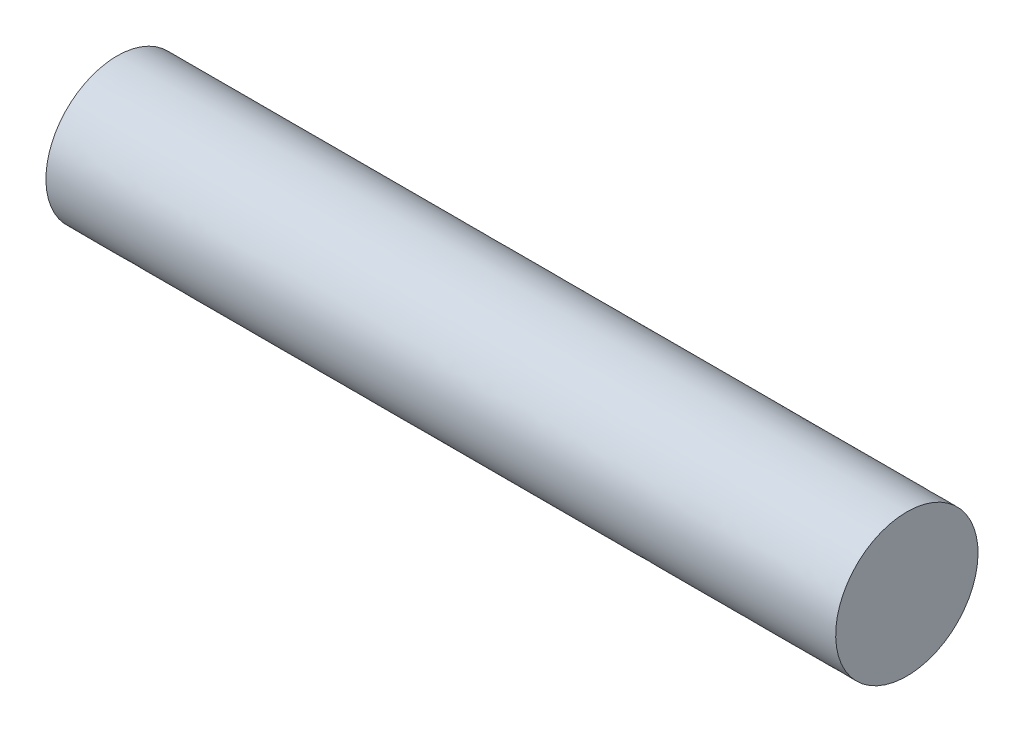
ISO-10303-21;
HEADER;
FILE_DESCRIPTION(('STEP AP214'),'2;1');
FILE_NAME('part.step','',(''),(''),'','','');
FILE_SCHEMA(('AUTOMOTIVE_DESIGN { 1 0 10303 214 1 1 1 1 }'));
ENDSEC;
DATA;
#1=APPLICATION_CONTEXT('core data for automotive mechanical design processes');
#2=APPLICATION_PROTOCOL_DEFINITION('international standard','automotive_design',2000,#1);
#3=PRODUCT_CONTEXT('',#1,'mechanical');
#4=PRODUCT('Part','Part','',(#3));
#5=PRODUCT_RELATED_PRODUCT_CATEGORY('part','',(#4));
#6=PRODUCT_DEFINITION_FORMATION('','',#4);
#7=PRODUCT_DEFINITION_CONTEXT('part definition',#1,'design');
#8=PRODUCT_DEFINITION('design','',#6,#7);
#9=PRODUCT_DEFINITION_SHAPE('','',#8);
#10=(LENGTH_UNIT() NAMED_UNIT(*) SI_UNIT(.MILLI.,.METRE.));
#11=(NAMED_UNIT(*) PLANE_ANGLE_UNIT() SI_UNIT($,.RADIAN.));
#12=(NAMED_UNIT(*) SI_UNIT($,.STERADIAN.) SOLID_ANGLE_UNIT());
#13=UNCERTAINTY_MEASURE_WITH_UNIT(LENGTH_MEASURE(1.E-05),#10,'distance_accuracy_value','');
#14=(GEOMETRIC_REPRESENTATION_CONTEXT(3) GLOBAL_UNCERTAINTY_ASSIGNED_CONTEXT((#13)) GLOBAL_UNIT_ASSIGNED_CONTEXT((#10,
#11,#12)) REPRESENTATION_CONTEXT('',''));
#15=CARTESIAN_POINT('',(0.,0.,0.));
#16=DIRECTION('',(0.,0.,1.));
#17=DIRECTION('',(1.,0.,0.));
#18=AXIS2_PLACEMENT_3D('',#15,#16,#17);
#19=CARTESIAN_POINT('',(1254.633,46.6198791903078,-2.17135769204912E-05));
#20=DIRECTION('',(1.,0.,0.));
#21=DIRECTION('',(0.,0.,-1.));
#22=AXIS2_PLACEMENT_3D('',#19,#20,#21);
#23=PLANE('',#22);
#24=CARTESIAN_POINT('',(1254.633,46.6198791903078,-2.17135769204912E-05));
#25=DIRECTION('',(1.,0.,0.));
#26=DIRECTION('',(0.,0.,-1.));
#27=AXIS2_PLACEMENT_3D('',#24,#25,#26);
#28=CIRCLE('',#27,80.23225);
#29=CARTESIAN_POINT('',(1254.633,126.852129190308,-2.17135769233751E-05));
#30=VERTEX_POINT('',#29);
#31=EDGE_CURVE('E12',#30,#30,#28,.T.);
#32=ORIENTED_EDGE('',*,*,#31,.T.);
#33=EDGE_LOOP('',(#32));
#34=FACE_BOUND('',#33,.T.);
#35=ADVANCED_FACE('F151',(#34),#23,.T.);
#36=CARTESIAN_POINT('',(284.607,126.852129190308,-2.17135769233751E-05));
#37=CARTESIAN_POINT('',(446.278,126.852129190308,-2.17135769233751E-05));
#38=CARTESIAN_POINT('',(769.62,126.852129190308,-2.17135769233751E-05));
#39=CARTESIAN_POINT('',(1092.962,126.852129190308,-2.17135769233751E-05));
#40=CARTESIAN_POINT('',(1254.633,126.852129190308,-2.17135769233751E-05));
#41=CARTESIAN_POINT('',(284.607,126.852129190308,7.2060606709319));
#42=CARTESIAN_POINT('',(446.278,126.852129190308,7.2060606709319));
#43=CARTESIAN_POINT('',(769.62,126.852129190308,7.2060606709319));
#44=CARTESIAN_POINT('',(1092.962,126.852129190308,7.2060606709319));
#45=CARTESIAN_POINT('',(1254.633,126.852129190308,7.2060606709319));
#46=CARTESIAN_POINT('',(284.607,124.899764770504,21.6176593161418));
#47=CARTESIAN_POINT('',(446.277999999999,124.899764770504,21.6176593161418));
#48=CARTESIAN_POINT('',(769.619999999999,124.899764770504,21.6176593161418));
#49=CARTESIAN_POINT('',(1092.962,124.899764770504,21.6176593161418));
#50=CARTESIAN_POINT('',(1254.633,124.899764770504,21.6176593161418));
#51=CARTESIAN_POINT('',(284.607,116.319986975036,41.675540282079));
#52=CARTESIAN_POINT('',(446.277999999999,116.319986975036,41.675540282079));
#53=CARTESIAN_POINT('',(769.619999999999,116.319986975036,41.675540282079));
#54=CARTESIAN_POINT('',(1092.962,116.319986975036,41.675540282079));
#55=CARTESIAN_POINT('',(1254.63299999999,116.319986975036,41.675540282079));
#56=CARTESIAN_POINT('',(284.607,102.711564342659,58.7258968160522));
#57=CARTESIAN_POINT('',(446.278,102.711564342659,58.7258968160522));
#58=CARTESIAN_POINT('',(769.620000000001,102.711564342659,58.7258968160522));
#59=CARTESIAN_POINT('',(1092.96200000001,102.711564342659,58.7258968160522));
#60=CARTESIAN_POINT('',(1254.63300000001,102.711564342659,58.7258968160522));
#61=CARTESIAN_POINT('',(284.607,85.0548821223029,71.538308750527));
#62=CARTESIAN_POINT('',(446.278,85.0548821223029,71.5383087505269));
#63=CARTESIAN_POINT('',(769.62,85.0548821223029,71.5383087505269));
#64=CARTESIAN_POINT('',(1092.96199999999,85.0548821223029,71.538308750527));
#65=CARTESIAN_POINT('',(1254.63299999999,85.0548821223029,71.538308750527));
#66=CARTESIAN_POINT('',(284.607,64.6247654169534,79.1885805113938));
#67=CARTESIAN_POINT('',(446.277999999999,64.6247654169534,79.1885805113938));
#68=CARTESIAN_POINT('',(769.619999999998,64.6247654169534,79.1885805113938));
#69=CARTESIAN_POINT('',(1092.96200000001,64.6247654169534,79.1885805113938));
#70=CARTESIAN_POINT('',(1254.63300000001,64.6247654169534,79.1885805113938));
#71=CARTESIAN_POINT('',(284.607,42.8955580592019,81.1238768920058));
#72=CARTESIAN_POINT('',(446.278,42.8955580592019,81.1238768920058));
#73=CARTESIAN_POINT('',(769.62,42.8955580592019,81.1238768920058));
#74=CARTESIAN_POINT('',(1092.962,42.8955580592019,81.1238768920058));
#75=CARTESIAN_POINT('',(1254.63299999999,42.8955580592019,81.1238768920058));
#76=CARTESIAN_POINT('',(284.607,21.4344126518132,77.2059164957971));
#77=CARTESIAN_POINT('',(446.278,21.4344126518132,77.2059164957971));
#78=CARTESIAN_POINT('',(769.62,21.4344126518132,77.2059164957971));
#79=CARTESIAN_POINT('',(1092.962,21.4344126518132,77.2059164957971));
#80=CARTESIAN_POINT('',(1254.633,21.4344126518132,77.2059164957971));
#81=CARTESIAN_POINT('',(284.607,8.33974195680666,70.8785551399347));
#82=CARTESIAN_POINT('',(446.278,8.33974195680666,70.8785551399347));
#83=CARTESIAN_POINT('',(769.62,8.33974195680666,70.8785551399347));
#84=CARTESIAN_POINT('',(1092.962,8.33974195680666,70.8785551399347));
#85=CARTESIAN_POINT('',(1254.633,8.33974195680666,70.8785551399347));
#86=CARTESIAN_POINT('',(284.607,-3.16612532323647,63.2615774138283));
#87=CARTESIAN_POINT('',(446.278,-3.16612532323648,63.2615774138283));
#88=CARTESIAN_POINT('',(769.62,-3.16612532323648,63.2615774138283));
#89=CARTESIAN_POINT('',(1092.962,-3.16612532323648,63.2615774138283));
#90=CARTESIAN_POINT('',(1254.633,-3.16612532323647,63.2615774138283));
#91=CARTESIAN_POINT('',(284.606999999999,-13.2589888713712,54.6221064894507));
#92=CARTESIAN_POINT('',(446.277999999999,-13.2589888713712,54.6221064894507));
#93=CARTESIAN_POINT('',(769.619999999999,-13.2589888713712,54.6221064894507));
#94=CARTESIAN_POINT('',(1092.962,-13.2589888713712,54.6221064894507));
#95=CARTESIAN_POINT('',(1254.633,-13.2589888713712,54.6221064894507));
#96=CARTESIAN_POINT('',(284.607,-24.7771506579053,38.3590654184431));
#97=CARTESIAN_POINT('',(446.278,-24.7771506579053,38.3590654184431));
#98=CARTESIAN_POINT('',(769.620000000001,-24.7771506579053,38.3590654184431));
#99=CARTESIAN_POINT('',(1092.962,-24.7771506579053,38.3590654184431));
#100=CARTESIAN_POINT('',(1254.633,-24.7771506579053,38.3590654184431));
#101=CARTESIAN_POINT('',(284.606999999999,-31.979786890219,19.7774458140325));
#102=CARTESIAN_POINT('',(446.277999999999,-31.979786890219,19.7774458140325));
#103=CARTESIAN_POINT('',(769.619999999999,-31.979786890219,19.7774458140325));
#104=CARTESIAN_POINT('',(1092.962,-31.979786890219,19.7774458140325));
#105=CARTESIAN_POINT('',(1254.633,-31.979786890219,19.7774458140325));
#106=CARTESIAN_POINT('',(284.607,-33.6123708096922,6.59256727078044));
#107=CARTESIAN_POINT('',(446.278,-33.6123708096922,6.59256727078044));
#108=CARTESIAN_POINT('',(769.62,-33.6123708096922,6.59256727078044));
#109=CARTESIAN_POINT('',(1092.962,-33.6123708096922,6.59256727078044));
#110=CARTESIAN_POINT('',(1254.633,-33.6123708096922,6.59256727078044));
#111=CARTESIAN_POINT('',(284.607,-33.6123708096922,-6.59261069793425));
#112=CARTESIAN_POINT('',(446.278,-33.6123708096922,-6.59261069793425));
#113=CARTESIAN_POINT('',(769.62,-33.6123708096922,-6.59261069793425));
#114=CARTESIAN_POINT('',(1092.962,-33.6123708096922,-6.59261069793425));
#115=CARTESIAN_POINT('',(1254.633,-33.6123708096922,-6.59261069793425));
#116=CARTESIAN_POINT('',(284.606999999999,-31.979786890219,-19.7774892411864));
#117=CARTESIAN_POINT('',(446.277999999999,-31.979786890219,-19.7774892411864));
#118=CARTESIAN_POINT('',(769.619999999998,-31.979786890219,-19.7774892411864));
#119=CARTESIAN_POINT('',(1092.962,-31.979786890219,-19.7774892411864));
#120=CARTESIAN_POINT('',(1254.633,-31.979786890219,-19.7774892411864));
#121=CARTESIAN_POINT('',(284.607000000001,-24.7771506579052,-38.3591088455969));
#122=CARTESIAN_POINT('',(446.278000000001,-24.7771506579052,-38.3591088455969));
#123=CARTESIAN_POINT('',(769.620000000001,-24.7771506579052,-38.3591088455969));
#124=CARTESIAN_POINT('',(1092.962,-24.7771506579052,-38.3591088455969));
#125=CARTESIAN_POINT('',(1254.633,-24.7771506579052,-38.3591088455969));
#126=CARTESIAN_POINT('',(284.606999999999,-13.2589888713712,-54.6221499166046));
#127=CARTESIAN_POINT('',(446.277999999999,-13.2589888713712,-54.6221499166046));
#128=CARTESIAN_POINT('',(769.619999999999,-13.2589888713712,-54.6221499166046));
#129=CARTESIAN_POINT('',(1092.962,-13.2589888713712,-54.6221499166046));
#130=CARTESIAN_POINT('',(1254.633,-13.2589888713712,-54.6221499166046));
#131=CARTESIAN_POINT('',(284.607,-3.1661253232365,-63.2616208409822));
#132=CARTESIAN_POINT('',(446.278,-3.1661253232365,-63.2616208409822));
#133=CARTESIAN_POINT('',(769.62,-3.1661253232365,-63.2616208409822));
#134=CARTESIAN_POINT('',(1092.962,-3.16612532323649,-63.2616208409822));
#135=CARTESIAN_POINT('',(1254.633,-3.1661253232365,-63.2616208409822));
#136=CARTESIAN_POINT('',(284.607,8.33974195680663,-70.8785985670885));
#137=CARTESIAN_POINT('',(446.278,8.33974195680663,-70.8785985670885));
#138=CARTESIAN_POINT('',(769.62,8.33974195680663,-70.8785985670885));
#139=CARTESIAN_POINT('',(1092.962,8.33974195680663,-70.8785985670885));
#140=CARTESIAN_POINT('',(1254.633,8.33974195680663,-70.8785985670885));
#141=CARTESIAN_POINT('',(284.606999999999,21.4344126518131,-77.2059599229507));
#142=CARTESIAN_POINT('',(446.277999999998,21.4344126518131,-77.2059599229507));
#143=CARTESIAN_POINT('',(769.619999999996,21.4344126518131,-77.2059599229507));
#144=CARTESIAN_POINT('',(1092.962,21.4344126518131,-77.2059599229507));
#145=CARTESIAN_POINT('',(1254.633,21.4344126518131,-77.2059599229507));
#146=CARTESIAN_POINT('',(284.607,42.8955580592019,-81.1239203191598));
#147=CARTESIAN_POINT('',(446.278000000001,42.8955580592019,-81.1239203191598));
#148=CARTESIAN_POINT('',(769.620000000003,42.8955580592019,-81.1239203191598));
#149=CARTESIAN_POINT('',(1092.962,42.8955580592019,-81.1239203191598));
#150=CARTESIAN_POINT('',(1254.633,42.8955580592019,-81.1239203191598));
#151=CARTESIAN_POINT('',(284.606999999999,64.6247654169531,-79.1886239385477));
#152=CARTESIAN_POINT('',(446.277999999999,64.6247654169531,-79.1886239385476));
#153=CARTESIAN_POINT('',(769.619999999998,64.6247654169531,-79.1886239385477));
#154=CARTESIAN_POINT('',(1092.962,64.6247654169531,-79.1886239385477));
#155=CARTESIAN_POINT('',(1254.63300000001,64.6247654169531,-79.1886239385477));
#156=CARTESIAN_POINT('',(284.607,85.0548821223032,-71.5383521776807));
#157=CARTESIAN_POINT('',(446.278,85.0548821223032,-71.5383521776807));
#158=CARTESIAN_POINT('',(769.620000000001,85.0548821223032,-71.5383521776807));
#159=CARTESIAN_POINT('',(1092.962,85.0548821223032,-71.5383521776807));
#160=CARTESIAN_POINT('',(1254.63299999999,85.0548821223032,-71.5383521776807));
#161=CARTESIAN_POINT('',(284.607,102.711564342658,-58.725940243206));
#162=CARTESIAN_POINT('',(446.277999999999,102.711564342658,-58.725940243206));
#163=CARTESIAN_POINT('',(769.619999999997,102.711564342658,-58.725940243206));
#164=CARTESIAN_POINT('',(1092.962,102.711564342658,-58.725940243206));
#165=CARTESIAN_POINT('',(1254.63300000001,102.711564342658,-58.725940243206));
#166=CARTESIAN_POINT('',(284.607,116.319986975036,-41.675583709233));
#167=CARTESIAN_POINT('',(446.278,116.319986975036,-41.675583709233));
#168=CARTESIAN_POINT('',(769.620000000002,116.319986975036,-41.675583709233));
#169=CARTESIAN_POINT('',(1092.962,116.319986975036,-41.675583709233));
#170=CARTESIAN_POINT('',(1254.63299999999,116.319986975036,-41.675583709233));
#171=CARTESIAN_POINT('',(284.607,124.899764770504,-21.6177027432956));
#172=CARTESIAN_POINT('',(446.277999999999,124.899764770504,-21.6177027432956));
#173=CARTESIAN_POINT('',(769.619999999999,124.899764770504,-21.6177027432956));
#174=CARTESIAN_POINT('',(1092.962,124.899764770504,-21.6177027432956));
#175=CARTESIAN_POINT('',(1254.633,124.899764770504,-21.6177027432956));
#176=CARTESIAN_POINT('',(284.607,126.852129190308,-7.20610409808575));
#177=CARTESIAN_POINT('',(446.278,126.852129190308,-7.20610409808575));
#178=CARTESIAN_POINT('',(769.62,126.852129190308,-7.20610409808575));
#179=CARTESIAN_POINT('',(1092.962,126.852129190308,-7.20610409808575));
#180=CARTESIAN_POINT('',(1254.633,126.852129190308,-7.20610409808575));
#181=CARTESIAN_POINT('',(284.607,126.852129190308,-2.17135769233751E-05));
#182=CARTESIAN_POINT('',(446.278,126.852129190308,-2.17135769233751E-05));
#183=CARTESIAN_POINT('',(769.62,126.852129190308,-2.17135769233751E-05));
#184=CARTESIAN_POINT('',(1092.962,126.852129190308,-2.17135769233751E-05));
#185=CARTESIAN_POINT('',(1254.633,126.852129190308,-2.17135769233751E-05));
#186=B_SPLINE_SURFACE_WITH_KNOTS('',3,3,((#36,#37,#38,#39,#40),(#41,#42,#43,#44,#45),(#46,#47,
#48,#49,#50),(#51,#52,#53,#54,#55),(#56,#57,#58,#59,#60),(#61,#62,#63,#64,#65),(#66,#67,#68,#69,
#70),(#71,#72,#73,#74,#75),(#76,#77,#78,#79,#80),(#81,#82,#83,#84,#85),(#86,#87,#88,#89,#90),
(#91,#92,#93,#94,#95),(#96,#97,#98,#99,#100),(#101,#102,#103,#104,#105),(#106,#107,#108,#109,
#110),(#111,#112,#113,#114,#115),(#116,#117,#118,#119,#120),(#121,#122,#123,#124,#125),(#126,
#127,#128,#129,#130),(#131,#132,#133,#134,#135),(#136,#137,#138,#139,#140),(#141,#142,#143,#144,
#145),(#146,#147,#148,#149,#150),(#151,#152,#153,#154,#155),(#156,#157,#158,#159,#160),(#161,
#162,#163,#164,#165),(#166,#167,#168,#169,#170),(#171,#172,#173,#174,#175),(#176,#177,#178,#179,
#180),(#181,#182,#183,#184,#185)),.UNSPECIFIED.,.T.,.F.,.F.,(4,1,1,1,1,1,1,1,2,1,1,1,2,1,1,1,2,
1,1,1,1,1,1,1,4),(4,1,4),(0.,0.0428836400011864,0.0857672800023728,0.128650920003559,
0.171534560004746,0.214418200005932,0.257301840007118,0.300185480008305,0.343069120009491,
0.382301840007118,0.421534560004746,0.460767280002373,0.5,0.539232719997627,0.578465439995254,
0.617698159992882,0.656930879990509,0.699814519991695,0.742698159992882,0.785581799994068,
0.828465439995254,0.871349079996441,0.914232719997627,0.957116359998814,1.),(0.,0.5,1.),.UNSPECIFIED.);
#187=CARTESIAN_POINT('',(364.489349045545,126.852129190308,-2.17135769233751E-05));
#188=CARTESIAN_POINT('',(364.489349045545,126.852128914495,-1.50276305642197));
#189=CARTESIAN_POINT('',(364.489349045545,126.80967587593,-3.00552524913252));
#190=CARTESIAN_POINT('',(364.489349045545,126.640460601901,-6.00672587417185));
#191=CARTESIAN_POINT('',(364.489349045545,126.513673450644,-7.50516289722871));
#192=CARTESIAN_POINT('',(364.489349045545,126.176385209391,-10.4926752945814));
#193=CARTESIAN_POINT('',(364.489349045545,125.965877978748,-11.9817499740342));
#194=CARTESIAN_POINT('',(364.489349045545,125.461450499816,-14.9475254684838));
#195=CARTESIAN_POINT('',(364.489349045545,125.167436355707,-16.4242104170891));
#196=CARTESIAN_POINT('',(364.489349045545,124.664468244764,-18.6248502152076));
#197=CARTESIAN_POINT('',(364.489349045545,124.48648555347,-19.3560064017951));
#198=CARTESIAN_POINT('',(364.489349045545,124.109928110193,-20.8129836086434));
#199=CARTESIAN_POINT('',(364.489349045545,123.911353603818,-21.5388046924273));
#200=CARTESIAN_POINT('',(364.489349045545,123.28495494023,-23.7073941956402));
#201=CARTESIAN_POINT('',(364.489349045545,122.826420281407,-25.1414435892626));
#202=CARTESIAN_POINT('',(364.489349045545,121.954373707818,-27.6257887670919));
#203=CARTESIAN_POINT('',(364.489349045545,121.558327182703,-28.6822814550293));
#204=CARTESIAN_POINT('',(364.489349045545,120.722118076175,-30.7777850375052));
#205=CARTESIAN_POINT('',(364.489349045545,120.281952671273,-31.8167948082094));
#206=CARTESIAN_POINT('',(364.489349045545,119.358335052558,-33.8753715629925));
#207=CARTESIAN_POINT('',(364.489349045545,118.874883165562,-34.8949386937958));
#208=CARTESIAN_POINT('',(364.489349045545,117.86548844747,-36.9127976663223));
#209=CARTESIAN_POINT('',(364.489349045545,117.339546472244,-37.91108993607));
#210=CARTESIAN_POINT('',(364.489349045545,116.246064843751,-39.8843175483958));
#211=CARTESIAN_POINT('',(364.489349045545,115.678535155737,-40.8592584126294));
#212=CARTESIAN_POINT('',(364.489349045545,114.502658683325,-42.7842124743037));
#213=CARTESIAN_POINT('',(364.489349045545,113.894311683647,-43.7342255402324));
#214=CARTESIAN_POINT('',(364.489349045545,112.638110364335,-45.607756456548));
#215=CARTESIAN_POINT('',(364.489349045545,111.990256085818,-46.5312743345074));
#216=CARTESIAN_POINT('',(364.489349045545,110.656277592495,-48.3502456902243));
#217=CARTESIAN_POINT('',(364.489349045545,109.970153306017,-49.2456991154172));
#218=CARTESIAN_POINT('',(364.489349045545,108.560532000185,-51.0074217788652));
#219=CARTESIAN_POINT('',(364.489349045545,107.837016550234,-51.8736762702239));
#220=CARTESIAN_POINT('',(364.489349045545,106.354169305101,-53.574964844388));
#221=CARTESIAN_POINT('',(364.489349045545,105.594837605083,-54.4099990101356));
#222=CARTESIAN_POINT('',(364.489349045545,104.041615410096,-56.0472820123145));
#223=CARTESIAN_POINT('',(364.489349045545,103.24772504392,-56.8495309709069));
#224=CARTESIAN_POINT('',(364.489349045545,101.626622867088,-58.4196246085889));
#225=CARTESIAN_POINT('',(364.489349045545,100.79941108888,-59.1874693211801));
#226=CARTESIAN_POINT('',(364.489349045545,99.1132452171638,-60.6875251507268));
#227=CARTESIAN_POINT('',(364.489349045545,98.2542901474537,-61.4197351702022));
#228=CARTESIAN_POINT('',(364.489349045545,96.5063035691606,-62.8473330489692));
#229=CARTESIAN_POINT('',(364.489349045545,95.6172719442278,-63.5427207657887));
#230=CARTESIAN_POINT('',(364.489349045545,93.8107524760895,-64.8954971935196));
#231=CARTESIAN_POINT('',(364.489349045545,92.8932645991389,-65.552885859367));
#232=CARTESIAN_POINT('',(364.489349045545,91.0314493956713,-66.8284889990251));
#233=CARTESIAN_POINT('',(364.489349045545,90.087122078053,-67.4467034858238));
#234=CARTESIAN_POINT('',(364.489349045545,88.1733450330486,-68.6427348005235));
#235=CARTESIAN_POINT('',(364.489349045545,87.2038977529324,-69.2205555435854));
#236=CARTESIAN_POINT('',(364.489349045545,85.2414123238665,-70.3346289324937));
#237=CARTESIAN_POINT('',(364.489349045545,84.2483742402841,-70.8708816935025));
#238=CARTESIAN_POINT('',(364.489349045545,82.240451021202,-71.9008419416545));
#239=CARTESIAN_POINT('',(364.489349045545,81.2255658293722,-72.3945493190832));
#240=CARTESIAN_POINT('',(364.489349045545,79.1759593579804,-73.3387271216437));
#241=CARTESIAN_POINT('',(364.489349045545,78.1412379921476,-73.789197358679));
#242=CARTESIAN_POINT('',(364.489349045545,75.0101099733037,-75.0746672023042));
#243=CARTESIAN_POINT('',(364.489349045545,72.8862700859371,-75.8439664515681));
#244=CARTESIAN_POINT('',(364.489349045545,68.5816698781501,-77.2011175240181));
#245=CARTESIAN_POINT('',(364.489349045545,66.4009102138694,-77.7889714378049));
#246=CARTESIAN_POINT('',(364.489349045545,61.9995514305502,-78.7772925978514));
#247=CARTESIAN_POINT('',(364.489349045545,59.7789928223042,-79.1779402725572));
#248=CARTESIAN_POINT('',(364.489349045545,55.3118021424258,-79.7913337151502));
#249=CARTESIAN_POINT('',(364.489349045545,53.0651698229818,-80.0040776956654));
#250=CARTESIAN_POINT('',(364.489349045545,49.6883700390174,-80.181188989375));
#251=CARTESIAN_POINT('',(364.489349045545,48.5615022203832,-80.2165546647555));
#252=CARTESIAN_POINT('',(364.489349045545,46.3072030010767,-80.2397972499676));
#253=CARTESIAN_POINT('',(364.489349045545,45.1797716028967,-80.2276743679887));
#254=CARTESIAN_POINT('',(364.489349045545,42.9264532346502,-80.1556958003728));
#255=CARTESIAN_POINT('',(364.489349045545,41.8005662629668,-80.0958401647445));
#256=CARTESIAN_POINT('',(364.489349045545,39.5523220986001,-79.9285976899502));
#257=CARTESIAN_POINT('',(364.489349045545,38.429964917369,-79.8212106967314));
#258=CARTESIAN_POINT('',(364.489349045545,36.190595660639,-79.5592833868368));
#259=CARTESIAN_POINT('',(364.489349045545,35.0735844296092,-79.4047358549477));
#260=CARTESIAN_POINT('',(364.489349045545,32.8470422934693,-79.0488410861966));
#261=CARTESIAN_POINT('',(364.489349045545,31.7375113897208,-78.8474938408159));
#262=CARTESIAN_POINT('',(364.489349045545,29.5278937786949,-78.3983542027957));
#263=CARTESIAN_POINT('',(364.489349045545,28.4278070400076,-78.1505619646877));
#264=CARTESIAN_POINT('',(364.489349045545,26.2390411861757,-77.6088921840408));
#265=CARTESIAN_POINT('',(364.489349045545,25.150362024437,-77.315014829814));
#266=CARTESIAN_POINT('',(364.489349045545,22.9863818847787,-76.6814917195724));
#267=CARTESIAN_POINT('',(364.489349045545,21.9110811054756,-76.3418452849496));
#268=CARTESIAN_POINT('',(364.489349045545,19.7758416882345,-75.6172808879288));
#269=CARTESIAN_POINT('',(364.489349045545,18.7159030727551,-75.232362859354));
#270=CARTESIAN_POINT('',(364.489349045545,16.613187676729,-74.4181939548215));
#271=CARTESIAN_POINT('',(364.489349045545,15.5704110023401,-73.9889428047539));
#272=CARTESIAN_POINT('',(364.489349045545,13.5038262096786,-73.0869739809294));
#273=CARTESIAN_POINT('',(364.489349045545,12.4800181458397,-72.6142561824609));
#274=CARTESIAN_POINT('',(364.489349045545,10.4524640786981,-71.6258931055084));
#275=CARTESIAN_POINT('',(364.489349045545,9.44873237209944,-71.1102184981818));
#276=CARTESIAN_POINT('',(364.489349045545,7.46385598163729,-70.0370972460643));
#277=CARTESIAN_POINT('',(364.489349045545,6.48271122653229,-69.4796507330499));
#278=CARTESIAN_POINT('',(364.489349045545,4.54481074482407,-68.3238656263013));
#279=CARTESIAN_POINT('',(364.489349045545,3.58805493446672,-67.7255271730203));
#280=CARTESIAN_POINT('',(364.489349045545,1.70076140800418,-66.4888394838052));
#281=CARTESIAN_POINT('',(364.489349045545,0.770223683691643,-65.8504902603965));
#282=CARTESIAN_POINT('',(364.489349045545,-1.06307283592759,-64.535099010993));
#283=CARTESIAN_POINT('',(364.489349045545,-1.9658318864946,-63.8580573407095));
#284=CARTESIAN_POINT('',(364.489349045545,-3.74205669901478,-62.4665754607562));
#285=CARTESIAN_POINT('',(364.489349045545,-4.61552234610449,-61.7521351044691));
#286=CARTESIAN_POINT('',(364.489349045545,-6.33163622896264,-60.2871507387313));
#287=CARTESIAN_POINT('',(364.489349045545,-7.17428440438121,-59.5366066585853));
#288=CARTESIAN_POINT('',(364.489349045545,-8.82723567607408,-58.000713181217));
#289=CARTESIAN_POINT('',(364.489349045545,-9.63753889931812,-57.2153639206476));
#290=CARTESIAN_POINT('',(364.489349045545,-11.2244536926632,-55.6109663493333));
#291=CARTESIAN_POINT('',(364.489349045545,-12.001057369051,-54.7919102297687));
#292=CARTESIAN_POINT('',(364.489349045545,-13.5188331469939,-53.1216018892949));
#293=CARTESIAN_POINT('',(364.489349045545,-14.2600052378366,-52.2703496586517));
#294=CARTESIAN_POINT('',(364.489349045545,-15.7057540411876,-50.537323532125));
#295=CARTESIAN_POINT('',(364.489349045545,-16.4103308298014,-49.6555496997221));
#296=CARTESIAN_POINT('',(364.489349045545,-17.7817366824732,-47.8631166798544));
#297=CARTESIAN_POINT('',(364.489349045545,-18.4485656066532,-46.9524573853713));
#298=CARTESIAN_POINT('',(364.489349045545,-19.7433201449206,-45.103894054353));
#299=CARTESIAN_POINT('',(364.489349045545,-20.3712458572425,-44.1659900866222));
#300=CARTESIAN_POINT('',(364.489349045545,-21.5870449030738,-42.2645759837951));
#301=CARTESIAN_POINT('',(364.489349045545,-22.1749184070083,-41.3010659576789));
#302=CARTESIAN_POINT('',(364.489349045545,-23.3094385228236,-39.3500660531306));
#303=CARTESIAN_POINT('',(364.489349045545,-23.8560850493567,-38.3625761250613));
#304=CARTESIAN_POINT('',(364.489349045545,-24.9070498714872,-36.3653228172068));
#305=CARTESIAN_POINT('',(364.489349045545,-25.4113681313389,-35.3555594186128));
#306=CARTESIAN_POINT('',(364.489349045545,-26.376330961458,-33.3170332604897));
#307=CARTESIAN_POINT('',(364.489349045545,-26.8370330609438,-32.2882977281231));
#308=CARTESIAN_POINT('',(364.489349045545,-27.7147929324241,-30.2123693848644));
#309=CARTESIAN_POINT('',(364.489349045545,-28.1318505785792,-29.1651765207648));
#310=CARTESIAN_POINT('',(364.489349045545,-28.9215951126493,-27.0541945852675));
#311=CARTESIAN_POINT('',(364.489349045545,-29.2942821304468,-25.9904055624607));
#312=CARTESIAN_POINT('',(364.489349045545,-29.9945672597358,-23.8480919824079));
#313=CARTESIAN_POINT('',(364.489349045545,-30.3221655755229,-22.7695674919522));
#314=CARTESIAN_POINT('',(364.489349045545,-30.9315086776399,-20.5996255106159));
#315=CARTESIAN_POINT('',(364.489349045545,-31.2132529170795,-19.5082078661284));
#316=CARTESIAN_POINT('',(364.489349045545,-31.7303076300251,-17.3144284497915));
#317=CARTESIAN_POINT('',(364.489349045545,-31.9656180296784,-16.2120666605386));
#318=CARTESIAN_POINT('',(364.489349045545,-32.3896167022082,-13.9984158362327));
#319=CARTESIAN_POINT('',(364.489349045545,-32.5783049648302,-12.8871267992163));
#320=CARTESIAN_POINT('',(364.489349045545,-32.9088106000688,-10.6575965355313));
#321=CARTESIAN_POINT('',(364.489349045545,-33.0506277891587,-9.53935528165835));
#322=CARTESIAN_POINT('',(364.489349045545,-33.2872911928356,-7.29659604060508));
#323=CARTESIAN_POINT('',(364.489349045545,-33.382082507337,-6.17207225978935));
#324=CARTESIAN_POINT('',(364.489349045545,-33.5242175003927,-3.920037925913));
#325=CARTESIAN_POINT('',(364.489349045545,-33.5715616004134,-2.79252739947238));
#326=CARTESIAN_POINT('',(364.489349045545,-33.6185131304616,-0.53651507804238));
#327=CARTESIAN_POINT('',(364.489349045545,-33.6181207440838,0.591986713117894));
#328=CARTESIAN_POINT('',(364.489349045545,-33.5696039587482,2.84798386325217));
#329=CARTESIAN_POINT('',(364.489349045545,-33.5214786190834,3.97547920195298));
#330=CARTESIAN_POINT('',(364.489349045545,-33.3777831972971,6.22745382961238));
#331=CARTESIAN_POINT('',(364.489349045545,-33.2822125454643,7.35193308219155));
#332=CARTESIAN_POINT('',(364.489349045545,-33.0438625167358,9.59580410580305));
#333=CARTESIAN_POINT('',(364.489349045545,-32.9010861711969,10.715196198834));
#334=CARTESIAN_POINT('',(364.489349045545,-32.5685765738731,12.9468757503778));
#335=CARTESIAN_POINT('',(364.489349045545,-32.3788477929576,14.0591638750008));
#336=CARTESIAN_POINT('',(364.489349045545,-31.9526236705524,16.2750320389487));
#337=CARTESIAN_POINT('',(364.489349045545,-31.7161167635195,17.3786098544036));
#338=CARTESIAN_POINT('',(364.489349045545,-31.1966461481638,19.5743705736066));
#339=CARTESIAN_POINT('',(364.489349045545,-30.9136987250013,20.6665573295442));
#340=CARTESIAN_POINT('',(364.489349045545,-30.30184118074,22.838116501937));
#341=CARTESIAN_POINT('',(364.489349045545,-29.9729256123798,23.9174873832302));
#342=CARTESIAN_POINT('',(364.489349045545,-29.2699426162878,26.0613711343471));
#343=CARTESIAN_POINT('',(364.489349045545,-28.8958771160057,27.1258846362691));
#344=CARTESIAN_POINT('',(364.489349045545,-28.1033037696349,29.2382365358867));
#345=CARTESIAN_POINT('',(364.489349045545,-27.6847959021828,30.2860749255663));
#346=CARTESIAN_POINT('',(364.489349045545,-26.8040052008844,32.3633528047297));
#347=CARTESIAN_POINT('',(364.489349045545,-26.3417166528927,33.3927898716176));
#348=CARTESIAN_POINT('',(364.489349045545,-25.3742788460361,35.4309842321397));
#349=CARTESIAN_POINT('',(364.489349045545,-24.8691410492885,36.4397469670452));
#350=CARTESIAN_POINT('',(364.489349045545,-23.8165336034239,38.435088165096));
#351=CARTESIAN_POINT('',(364.489349045545,-23.269059871646,39.4216644768248));
#352=CARTESIAN_POINT('',(364.489349045545,-22.1329480101513,41.3708262009662));
#353=CARTESIAN_POINT('',(364.489349045545,-21.5443069019732,42.3334098706621));
#354=CARTESIAN_POINT('',(364.489349045545,-19.7193474484929,45.1811660917604));
#355=CARTESIAN_POINT('',(364.489349045545,-18.4229405019477,47.0283368592164));
#356=CARTESIAN_POINT('',(364.489349045545,-15.6797023022803,50.6070104641675));
#357=CARTESIAN_POINT('',(364.489349045545,-14.2328716963868,52.3385137992929));
#358=CARTESIAN_POINT('',(364.489349045545,-11.19783860492,55.6729727725261));
#359=CARTESIAN_POINT('',(364.489349045545,-9.60963546785023,57.2759278181714));
#360=CARTESIAN_POINT('',(364.489349045545,-6.30421936201992,60.3427014494263));
#361=CARTESIAN_POINT('',(364.489349045545,-4.58700599536139,61.8065196058734));
#362=CARTESIAN_POINT('',(364.489349045545,-1.03383733548276,64.5861686982532));
#363=CARTESIAN_POINT('',(364.489349045545,0.802235947696528,65.9018489195698));
#364=CARTESIAN_POINT('',(364.489349045545,4.57910747031371,68.3730150624879));
#365=CARTESIAN_POINT('',(364.489349045545,6.51990632435474,69.5285000438093));
#366=CARTESIAN_POINT('',(364.489349045545,10.4919831303171,71.672370841957));
#367=CARTESIAN_POINT('',(364.489349045545,12.5232602586719,72.6607581793751));
#368=CARTESIAN_POINT('',(364.489349045545,15.6265202099253,74.0124522344856));
#369=CARTESIAN_POINT('',(364.489349045545,16.6704447231468,74.4412409990404));
#370=CARTESIAN_POINT('',(364.489349045545,18.775514107264,75.2544272577352));
#371=CARTESIAN_POINT('',(364.489349045545,19.8366588968197,75.6388249614869));
#372=CARTESIAN_POINT('',(364.489349045545,21.9738394095863,76.3620932888908));
#373=CARTESIAN_POINT('',(364.489349045545,23.0498683462771,76.7009839530441));
#374=CARTESIAN_POINT('',(364.489349045545,25.2151945473379,77.3329430761776));
#375=CARTESIAN_POINT('',(364.489349045545,26.3044918591395,77.6260113713011));
#376=CARTESIAN_POINT('',(364.489349045545,29.5895679977414,78.436009031712));
#377=CARTESIAN_POINT('',(364.489349045545,31.802986197111,78.8838849909122));
#378=CARTESIAN_POINT('',(364.489349045545,35.144521311612,79.4149976331659));
#379=CARTESIAN_POINT('',(364.489349045545,36.2620635820574,79.568594498265));
#380=CARTESIAN_POINT('',(364.489349045545,38.5027278002007,79.8286164372527));
#381=CARTESIAN_POINT('',(364.489349045545,39.6258497252186,79.9350417027261));
#382=CARTESIAN_POINT('',(364.489349045545,41.8755596813092,80.1002891331746));
#383=CARTESIAN_POINT('',(364.489349045545,43.0021476976252,80.1591115005349));
#384=CARTESIAN_POINT('',(364.489349045545,45.2568120120387,80.2289759222062));
#385=CARTESIAN_POINT('',(364.489349045545,46.3848883126162,80.2400178967966));
#386=CARTESIAN_POINT('',(364.489349045545,48.6396124752141,80.2145654294302));
#387=CARTESIAN_POINT('',(364.489349045545,49.7662607631033,80.1781083391774));
#388=CARTESIAN_POINT('',(364.489349045545,52.0170329697533,80.0578857400294));
#389=CARTESIAN_POINT('',(364.489349045545,53.1411568826979,79.9741201222459));
#390=CARTESIAN_POINT('',(364.489349045545,55.3848936335014,79.7594602715522));
#391=CARTESIAN_POINT('',(364.489349045545,56.504506480359,79.6285661327016));
#392=CARTESIAN_POINT('',(364.489349045545,58.7372363346621,79.3198206099652));
#393=CARTESIAN_POINT('',(364.489349045545,59.8503533633407,79.1419693796572));
#394=CARTESIAN_POINT('',(364.489349045545,62.0681105970106,78.7394840508651));
#395=CARTESIAN_POINT('',(364.489349045545,63.1727507298154,78.5148495544464));
#396=CARTESIAN_POINT('',(364.489349045545,65.3715178305426,78.0189653165544));
#397=CARTESIAN_POINT('',(364.489349045545,66.4656448014826,77.7477155884615));
#398=CARTESIAN_POINT('',(364.489349045545,68.6414836457056,77.159297768667));
#399=CARTESIAN_POINT('',(364.489349045545,69.723195449969,76.8421294218239));
#400=CARTESIAN_POINT('',(364.489349045545,71.8723275271728,76.1625850509953));
#401=CARTESIAN_POINT('',(364.489349045545,72.9397477464497,75.8002088573117));
#402=CARTESIAN_POINT('',(364.489349045545,75.0596273153452,75.030515937061));
#403=CARTESIAN_POINT('',(364.489349045545,76.1120683792658,74.6231488474257));
#404=CARTESIAN_POINT('',(364.489349045545,78.1988833608073,73.7645057384479));
#405=CARTESIAN_POINT('',(364.489349045545,79.2332572825042,73.3132297290115));
#406=CARTESIAN_POINT('',(364.489349045545,81.2820648714113,72.3674837392857));
#407=CARTESIAN_POINT('',(364.489349045545,82.2964986518416,71.8730140043373));
#408=CARTESIAN_POINT('',(364.489349045545,84.3034990780593,70.8415437162343));
#409=CARTESIAN_POINT('',(364.489349045545,85.2960657742285,70.3045432610835));
#410=CARTESIAN_POINT('',(364.489349045545,87.2575588655116,69.1890085912754));
#411=CARTESIAN_POINT('',(364.489349045545,88.2264861525218,68.6104759468514));
#412=CARTESIAN_POINT('',(364.489349045545,90.1390256830636,67.4131708065562));
#413=CARTESIAN_POINT('',(364.489349045545,91.0826378172739,66.7943981369514));
#414=CARTESIAN_POINT('',(364.489349045545,93.8732514524604,64.8792823174881));
#415=CARTESIAN_POINT('',(364.489349045545,95.6804620621439,63.523895559351));
#416=CARTESIAN_POINT('',(364.489349045545,98.3003399899078,61.3809718106032));
#417=CARTESIAN_POINT('',(364.489349045545,99.1586015531139,60.6482352377999));
#418=CARTESIAN_POINT('',(364.489349045545,100.843463701312,59.1470726679288));
#419=CARTESIAN_POINT('',(364.489349045545,101.670064371557,58.3786467669736));
#420=CARTESIAN_POINT('',(364.489349045545,103.289918282942,56.8074183224438));
#421=CARTESIAN_POINT('',(364.489349045545,104.083171275308,56.0046155225056));
#422=CARTESIAN_POINT('',(364.489349045545,105.635059598859,54.3663113061712));
#423=CARTESIAN_POINT('',(364.489349045545,106.393694921749,53.5308098819378));
#424=CARTESIAN_POINT('',(364.489349045545,108.616129608966,50.977173812246));
#425=CARTESIAN_POINT('',(364.489349045545,110.026421383745,49.2119426168477));
#426=CARTESIAN_POINT('',(364.489349045545,112.693543312661,45.5692813219248));
#427=CARTESIAN_POINT('',(364.489349045545,113.950377668144,43.6918542961853));
#428=CARTESIAN_POINT('',(364.489349045545,115.908356959254,40.4805150664085));
#429=CARTESIAN_POINT('',(364.489349045545,116.655036715232,39.1741514653843));
#430=CARTESIAN_POINT('',(364.489349045545,118.073774650161,36.52138472667));
#431=CARTESIAN_POINT('',(364.489349045545,118.745830531339,35.1749803576864));
#432=CARTESIAN_POINT('',(364.489349045545,120.013458491394,32.4465379522829));
#433=CARTESIAN_POINT('',(364.489349045545,120.609024784791,31.0644972299005));
#434=CARTESIAN_POINT('',(364.489349045545,121.721137504993,28.2707425344393));
#435=CARTESIAN_POINT('',(364.489349045545,122.237770587992,26.8590630657941));
#436=CARTESIAN_POINT('',(364.489349045545,123.190870299283,24.0090304492211));
#437=CARTESIAN_POINT('',(364.489349045545,123.6273441012,22.5706797008591));
#438=CARTESIAN_POINT('',(364.489349045545,124.418216215581,19.6720137510197));
#439=CARTESIAN_POINT('',(364.489349045545,124.772637699612,18.2117048748777));
#440=CARTESIAN_POINT('',(364.489349045545,125.378867422043,15.3678190022299));
#441=CARTESIAN_POINT('',(364.489349045545,125.635800774715,13.9853310840595));
#442=CARTESIAN_POINT('',(364.489349045545,126.076855825397,11.2090747881664));
#443=CARTESIAN_POINT('',(364.489349045545,126.260992649638,9.81530881537211));
#444=CARTESIAN_POINT('',(364.489349045545,126.556026633433,7.02004295898337));
#445=CARTESIAN_POINT('',(364.489349045545,126.666923642445,5.61854305949827));
#446=CARTESIAN_POINT('',(364.489349045545,126.81498275072,2.81136149155613));
#447=CARTESIAN_POINT('',(364.489349045545,126.852129448309,1.40567901099931));
#448=CARTESIAN_POINT('',(364.489349045545,126.852129190308,-2.17135769233751E-05));
#449=B_SPLINE_CURVE_WITH_KNOTS('',3,(#187,#188,#189,#190,#191,#192,#193,#194,#195,#196,#197,
#198,#199,#200,#201,#202,#203,#204,#205,#206,#207,#208,#209,#210,#211,#212,#213,#214,#215,#216,
#217,#218,#219,#220,#221,#222,#223,#224,#225,#226,#227,#228,#229,#230,#231,#232,#233,#234,#235,
#236,#237,#238,#239,#240,#241,#242,#243,#244,#245,#246,#247,#248,#249,#250,#251,#252,#253,#254,
#255,#256,#257,#258,#259,#260,#261,#262,#263,#264,#265,#266,#267,#268,#269,#270,#271,#272,#273,
#274,#275,#276,#277,#278,#279,#280,#281,#282,#283,#284,#285,#286,#287,#288,#289,#290,#291,#292,
#293,#294,#295,#296,#297,#298,#299,#300,#301,#302,#303,#304,#305,#306,#307,#308,#309,#310,#311,
#312,#313,#314,#315,#316,#317,#318,#319,#320,#321,#322,#323,#324,#325,#326,#327,#328,#329,#330,
#331,#332,#333,#334,#335,#336,#337,#338,#339,#340,#341,#342,#343,#344,#345,#346,#347,#348,#349,
#350,#351,#352,#353,#354,#355,#356,#357,#358,#359,#360,#361,#362,#363,#364,#365,#366,#367,#368,
#369,#370,#371,#372,#373,#374,#375,#376,#377,#378,#379,#380,#381,#382,#383,#384,#385,#386,#387,
#388,#389,#390,#391,#392,#393,#394,#395,#396,#397,#398,#399,#400,#401,#402,#403,#404,#405,#406,
#407,#408,#409,#410,#411,#412,#413,#414,#415,#416,#417,#418,#419,#420,#421,#422,#423,#424,#425,
#426,#427,#428,#429,#430,#431,#432,#433,#434,#435,#436,#437,#438,#439,#440,#441,#442,#443,#444,
#445,#446,#447,#448),.UNSPECIFIED.,.T.,.F.,(4,2,2,2,2,2,2,2,2,2,2,2,2,2,2,2,2,2,2,2,2,2,2,2,2,2,
2,2,2,2,2,2,2,2,2,2,2,2,2,2,2,2,2,2,2,2,2,2,2,2,2,2,2,2,2,2,2,2,2,2,2,2,2,2,2,2,2,2,2,2,2,2,2,2,
2,2,2,2,2,2,2,2,2,2,2,2,2,2,2,2,2,2,2,2,2,2,2,2,2,2,2,2,2,2,2,2,2,2,2,2,2,2,2,2,2,2,2,2,2,2,2,2,
2,2,2,2,2,2,2,2,4),(0.,4.50767289416951,9.01667813360358,13.5260141576467,18.0404407242914,
20.2977009308903,22.5549342174413,27.0689253317888,30.4528848076237,33.8370609859958,
37.2212116154789,40.6052940955239,43.9885683162437,47.3718603825539,50.7551489278684,
54.1384438097077,57.523422570689,60.9083923382609,64.2933494919374,67.6783033493965,
71.0633613910467,74.4484325291365,77.8335076815849,81.2185817117195,84.6033271875568,
87.9880632857582,91.3728081121224,94.7575676626274,101.525509725439,108.293373805581,
115.054701528567,121.816093565761,125.197543603893,128.578978817789,131.960410489025,
135.341853119827,138.723813345919,142.105774187617,145.487723777081,148.869659547648,
152.251645466946,155.633636330012,159.015648105043,162.397669583819,165.782019372869,
169.166358485872,172.550685975143,175.935012404968,179.319307726673,182.703616317117,
186.087931534699,189.472233465885,192.857323896459,196.242415350475,199.6274997644,
203.012596721236,206.397685130021,209.782759134111,213.167840145762,216.552924016047,
219.93347891009,223.314043550968,226.694598295962,230.075137723254,233.455717466452,
236.836302586397,240.216888449903,243.597487550159,246.982024077998,250.366530541257,
253.751023987694,257.135584136064,260.520184926365,263.904568413622,267.288629759589,
270.673528837773,274.057243469342,277.441359414281,280.825330942437,284.209304097269,
287.593719530131,290.977232474137,294.361072114691,297.745156829958,304.506586223108,
311.267986525026,318.029417987577,324.790870304834,331.559140681989,338.327450784425,
345.095699291793,348.480542320946,351.865369366429,355.248700870491,358.632044472767,
365.39729464681,368.780695090945,372.164081793449,375.547454111293,378.930832074216,
382.311551065017,385.692277837119,389.072997861955,392.45370682995,395.834444555144,
399.215181309933,402.595936850114,405.97670508112,409.361296873864,412.74588790302,
416.1304597089,419.515023715909,422.89945982791,426.283910552952,433.051325697285,
436.436076650002,439.820818487996,443.205585571894,446.590353467054,453.36004057908,
460.129542309601,464.641423446149,469.15344347128,473.665804573593,478.173175658508,
482.680143172421,487.185836362324,491.402410644362,495.61810831253,499.833814645789,
504.050401275056),.UNSPECIFIED.);
#450=CARTESIAN_POINT('',(364.489349045545,126.852129190308,-2.17135769233751E-05));
#451=VERTEX_POINT('',#450);
#452=EDGE_CURVE('E155',#451,#451,#449,.T.);
#453=CARTESIAN_POINT('',(364.489349045545,126.852129190308,-2.17135769233751E-05));
#454=CARTESIAN_POINT('',(373.761678742988,126.852129190308,-2.17135769233751E-05));
#455=CARTESIAN_POINT('',(383.03400844043,126.852129190308,-2.17135769233751E-05));
#456=CARTESIAN_POINT('',(401.578667835314,126.852129190308,-2.17135769233751E-05));
#457=CARTESIAN_POINT('',(410.850997532756,126.852129190308,-2.17135769233751E-05));
#458=CARTESIAN_POINT('',(429.395656927641,126.852129190308,-2.17135769233751E-05));
#459=CARTESIAN_POINT('',(438.667986625083,126.852129190308,-2.17135769233751E-05));
#460=CARTESIAN_POINT('',(457.212646019968,126.852129190308,-2.17135769233751E-05));
#461=CARTESIAN_POINT('',(466.48497571741,126.852129190308,-2.17135769233751E-05));
#462=CARTESIAN_POINT('',(485.029635112294,126.852129190308,-2.17135769233751E-05));
#463=CARTESIAN_POINT('',(494.301964809737,126.852129190308,-2.17135769233751E-05));
#464=CARTESIAN_POINT('',(512.846624204621,126.852129190308,-2.17135769233751E-05));
#465=CARTESIAN_POINT('',(522.118953902063,126.852129190308,-2.17135769233751E-05));
#466=CARTESIAN_POINT('',(540.663613296948,126.852129190308,-2.17135769233751E-05));
#467=CARTESIAN_POINT('',(549.93594299439,126.852129190308,-2.17135769233751E-05));
#468=CARTESIAN_POINT('',(568.480602389274,126.852129190308,-2.17135769233751E-05));
#469=CARTESIAN_POINT('',(577.752932086717,126.852129190308,-2.17135769233751E-05));
#470=CARTESIAN_POINT('',(596.297591481601,126.852129190308,-2.17135769233751E-05));
#471=CARTESIAN_POINT('',(605.569921179043,126.852129190308,-2.17135769233751E-05));
#472=CARTESIAN_POINT('',(624.114580573928,126.852129190308,-2.17135769233751E-05));
#473=CARTESIAN_POINT('',(633.38691027137,126.852129190308,-2.17135769233751E-05));
#474=CARTESIAN_POINT('',(651.931569666254,126.852129190308,-2.17135769233751E-05));
#475=CARTESIAN_POINT('',(661.203899363697,126.852129190308,-2.17135769233751E-05));
#476=CARTESIAN_POINT('',(679.748558758581,126.852129190308,-2.17135769233751E-05));
#477=CARTESIAN_POINT('',(689.020888456023,126.852129190308,-2.17135769233751E-05));
#478=CARTESIAN_POINT('',(707.565547850908,126.852129190308,-2.17135769233751E-05));
#479=CARTESIAN_POINT('',(716.83787754835,126.852129190308,-2.17135769233751E-05));
#480=CARTESIAN_POINT('',(735.382536943235,126.852129190308,-2.17135769233751E-05));
#481=CARTESIAN_POINT('',(744.654866640677,126.852129190308,-2.17135769233751E-05));
#482=CARTESIAN_POINT('',(763.199526035561,126.852129190308,-2.17135769233751E-05));
#483=CARTESIAN_POINT('',(772.471855733004,126.852129190308,-2.17135769233751E-05));
#484=CARTESIAN_POINT('',(791.016515127888,126.852129190308,-2.17135769233751E-05));
#485=CARTESIAN_POINT('',(800.28884482533,126.852129190308,-2.17135769233751E-05));
#486=CARTESIAN_POINT('',(818.833504220215,126.852129190308,-2.17135769233751E-05));
#487=CARTESIAN_POINT('',(828.105833917657,126.852129190308,-2.17135769233751E-05));
#488=CARTESIAN_POINT('',(846.650493312541,126.852129190308,-2.17135769233751E-05));
#489=CARTESIAN_POINT('',(855.922823009984,126.852129190308,-2.17135769233751E-05));
#490=CARTESIAN_POINT('',(874.467482404868,126.852129190308,-2.17135769233751E-05));
#491=CARTESIAN_POINT('',(883.73981210231,126.852129190308,-2.17135769233751E-05));
#492=CARTESIAN_POINT('',(902.284471497195,126.852129190308,-2.17135769233751E-05));
#493=CARTESIAN_POINT('',(911.556801194637,126.852129190308,-2.17135769233751E-05));
#494=CARTESIAN_POINT('',(930.101460589521,126.852129190308,-2.17135769233751E-05));
#495=CARTESIAN_POINT('',(939.373790286964,126.852129190308,-2.17135769233751E-05));
#496=CARTESIAN_POINT('',(957.918449681848,126.852129190308,-2.17135769233751E-05));
#497=CARTESIAN_POINT('',(967.190779379291,126.852129190308,-2.17135769233751E-05));
#498=CARTESIAN_POINT('',(985.735438774175,126.852129190308,-2.17135769233751E-05));
#499=CARTESIAN_POINT('',(995.007768471617,126.852129190308,-2.17135769233751E-05));
#500=CARTESIAN_POINT('',(1013.5524278665,126.852129190308,-2.17135769233751E-05));
#501=CARTESIAN_POINT('',(1022.82475756394,126.852129190308,-2.17135769233751E-05));
#502=CARTESIAN_POINT('',(1041.36941695883,126.852129190308,-2.17135769233751E-05));
#503=CARTESIAN_POINT('',(1050.64174665627,126.852129190308,-2.17135769233751E-05));
#504=CARTESIAN_POINT('',(1069.18640605116,126.852129190308,-2.17135769233751E-05));
#505=CARTESIAN_POINT('',(1078.4587357486,126.852129190308,-2.17135769233751E-05));
#506=CARTESIAN_POINT('',(1097.00339514348,126.852129190308,-2.17135769233751E-05));
#507=CARTESIAN_POINT('',(1106.27572484092,126.852129190308,-2.17135769233751E-05));
#508=CARTESIAN_POINT('',(1124.82038423581,126.852129190308,-2.17135769233751E-05));
#509=CARTESIAN_POINT('',(1134.09271393325,126.852129190308,-2.17135769233751E-05));
#510=CARTESIAN_POINT('',(1152.63737332814,126.852129190308,-2.17135769233751E-05));
#511=CARTESIAN_POINT('',(1161.90970302558,126.852129190308,-2.17135769233751E-05));
#512=CARTESIAN_POINT('',(1180.45436242046,126.852129190308,-2.17135769233751E-05));
#513=CARTESIAN_POINT('',(1189.7266921179,126.852129190308,-2.17135769233751E-05));
#514=CARTESIAN_POINT('',(1208.27135151279,126.852129190308,-2.17135769233751E-05));
#515=CARTESIAN_POINT('',(1217.54368121023,126.852129190308,-2.17135769233751E-05));
#516=CARTESIAN_POINT('',(1236.08834060512,126.852129190308,-2.17135769233751E-05));
#517=CARTESIAN_POINT('',(1245.36067030256,126.852129190308,-2.17135769233751E-05));
#518=CARTESIAN_POINT('',(1254.633,126.852129190308,-2.17135769233751E-05));
#519=B_SPLINE_CURVE_WITH_KNOTS('',3,(#453,#454,#455,#456,#457,#458,#459,#460,#461,#462,#463,
#464,#465,#466,#467,#468,#469,#470,#471,#472,#473,#474,#475,#476,#477,#478,#479,#480,#481,#482,
#483,#484,#485,#486,#487,#488,#489,#490,#491,#492,#493,#494,#495,#496,#497,#498,#499,#500,#501,
#502,#503,#504,#505,#506,#507,#508,#509,#510,#511,#512,#513,#514,#515,#516,#517,#518),
.UNSPECIFIED.,.F.,.F.,(4,2,2,2,2,2,2,2,2,2,2,2,2,2,2,2,2,2,2,2,2,2,2,2,2,2,2,2,2,2,2,2,4),(0.,
27.8169890923267,55.6339781846533,83.4509672769802,111.267956369307,139.084945461634,
166.90193455396,194.718923646287,222.535912738614,250.35290183094,278.169890923267,
305.986880015594,333.80386910792,361.620858200247,389.437847292574,417.2548363849,
445.071825477227,472.888814569554,500.705803661881,528.522792754207,556.339781846534,
584.156770938861,611.973760031188,639.790749123514,667.607738215841,695.424727308167,
723.241716400494,751.058705492821,778.875694585147,806.692683677474,834.509672769801,
862.326661862128,890.143650954454),.UNSPECIFIED.);
#520=EDGE_CURVE('BSEAM181',#451,#30,#519,.T.);
#521=ORIENTED_EDGE('',*,*,#452,.F.);
#522=ORIENTED_EDGE('',*,*,#31,.F.);
#523=ORIENTED_EDGE('',*,*,#520,.T.);
#524=ORIENTED_EDGE('',*,*,#520,.F.);
#525=EDGE_LOOP('',(#521,#523,#522,#524));
#526=FACE_BOUND('',#525,.T.);
#527=ADVANCED_FACE('F181',(#526),#186,.T.);
#528=CARTESIAN_POINT('',(364.489349045545,179.629005935536,-80.2427918692879));
#529=DIRECTION('',(1.,0.,0.));
#530=DIRECTION('',(0.,0.,-1.));
#531=AXIS2_PLACEMENT_3D('',#528,#529,#530);
#532=PLANE('',#531);
#533=ORIENTED_EDGE('',*,*,#452,.T.);
#534=EDGE_LOOP('',(#533));
#535=FACE_BOUND('',#534,.T.);
#536=ADVANCED_FACE('F191',(#535),#532,.F.);
#537=CLOSED_SHELL('',(#35,#527,#536));
#538=MANIFOLD_SOLID_BREP('B2',#537);
#539=ADVANCED_BREP_SHAPE_REPRESENTATION('',(#18,#538),#14);
#540=SHAPE_DEFINITION_REPRESENTATION(#9,#539);
ENDSEC;
END-ISO-10303-21;
